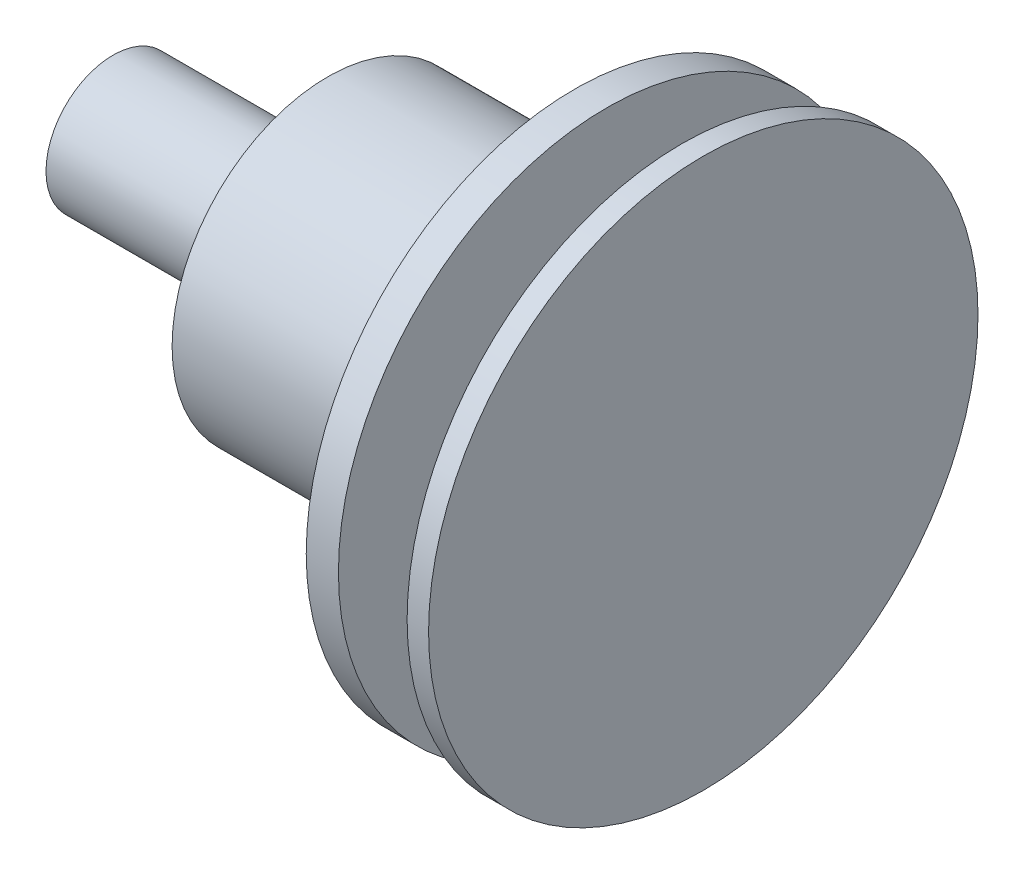
ISO-10303-21;
HEADER;
FILE_DESCRIPTION(('STEP AP214'),'2;1');
FILE_NAME('part.step','',(''),(''),'','','');
FILE_SCHEMA(('AUTOMOTIVE_DESIGN { 1 0 10303 214 1 1 1 1 }'));
ENDSEC;
DATA;
#1=APPLICATION_CONTEXT('core data for automotive mechanical design processes');
#2=APPLICATION_PROTOCOL_DEFINITION('international standard','automotive_design',2000,#1);
#3=PRODUCT_CONTEXT('',#1,'mechanical');
#4=PRODUCT('Part','Part','',(#3));
#5=PRODUCT_RELATED_PRODUCT_CATEGORY('part','',(#4));
#6=PRODUCT_DEFINITION_FORMATION('','',#4);
#7=PRODUCT_DEFINITION_CONTEXT('part definition',#1,'design');
#8=PRODUCT_DEFINITION('design','',#6,#7);
#9=PRODUCT_DEFINITION_SHAPE('','',#8);
#10=(LENGTH_UNIT() NAMED_UNIT(*) SI_UNIT(.MILLI.,.METRE.));
#11=(NAMED_UNIT(*) PLANE_ANGLE_UNIT() SI_UNIT($,.RADIAN.));
#12=(NAMED_UNIT(*) SI_UNIT($,.STERADIAN.) SOLID_ANGLE_UNIT());
#13=UNCERTAINTY_MEASURE_WITH_UNIT(LENGTH_MEASURE(1.E-05),#10,'distance_accuracy_value','');
#14=(GEOMETRIC_REPRESENTATION_CONTEXT(3) GLOBAL_UNCERTAINTY_ASSIGNED_CONTEXT((#13)) GLOBAL_UNIT_ASSIGNED_CONTEXT((#10,
#11,#12)) REPRESENTATION_CONTEXT('',''));
#15=CARTESIAN_POINT('',(0.,0.,0.));
#16=DIRECTION('',(0.,0.,1.));
#17=DIRECTION('',(1.,0.,0.));
#18=AXIS2_PLACEMENT_3D('',#15,#16,#17);
#19=CARTESIAN_POINT('',(0.,0.,0.));
#20=DIRECTION('',(1.,0.,0.));
#21=DIRECTION('',(0.,0.,-1.));
#22=AXIS2_PLACEMENT_3D('',#19,#20,#21);
#23=PLANE('',#22);
#24=CARTESIAN_POINT('',(0.,0.,0.));
#25=DIRECTION('',(-1.,0.,0.));
#26=DIRECTION('',(0.,0.,1.));
#27=AXIS2_PLACEMENT_3D('',#24,#25,#26);
#28=CIRCLE('',#27,7.93750000000001);
#29=CARTESIAN_POINT('',(0.,0.,7.93750000000001));
#30=VERTEX_POINT('',#29);
#31=EDGE_CURVE('E10',#30,#30,#28,.T.);
#32=ORIENTED_EDGE('',*,*,#31,.T.);
#33=EDGE_LOOP('',(#32));
#34=FACE_BOUND('',#33,.T.);
#35=ADVANCED_FACE('F47',(#34),#23,.F.);
#36=CARTESIAN_POINT('',(0.,0.,0.));
#37=DIRECTION('',(-1.,0.,0.));
#38=DIRECTION('',(0.,0.,1.));
#39=AXIS2_PLACEMENT_3D('',#36,#37,#38);
#40=CYLINDRICAL_SURFACE('',#39,7.93750000000001);
#41=ORIENTED_EDGE('',*,*,#31,.F.);
#42=EDGE_LOOP('',(#41));
#43=FACE_BOUND('',#42,.T.);
#44=CARTESIAN_POINT('',(25.4,0.,0.));
#45=DIRECTION('',(-1.,0.,0.));
#46=DIRECTION('',(0.,0.,1.));
#47=AXIS2_PLACEMENT_3D('',#44,#45,#46);
#48=CIRCLE('',#47,7.9375);
#49=CARTESIAN_POINT('',(25.4,0.,7.9375));
#50=VERTEX_POINT('',#49);
#51=EDGE_CURVE('E54',#50,#50,#48,.T.);
#52=ORIENTED_EDGE('',*,*,#51,.T.);
#53=EDGE_LOOP('',(#52));
#54=FACE_BOUND('',#53,.T.);
#55=ADVANCED_FACE('F107',(#43,#54),#40,.T.);
#56=CARTESIAN_POINT('',(25.4,7.9375,0.));
#57=DIRECTION('',(1.,0.,0.));
#58=DIRECTION('',(0.,0.,-1.));
#59=AXIS2_PLACEMENT_3D('',#56,#57,#58);
#60=PLANE('',#59);
#61=ORIENTED_EDGE('',*,*,#51,.F.);
#62=EDGE_LOOP('',(#61));
#63=FACE_BOUND('',#62,.T.);
#64=CARTESIAN_POINT('',(25.4,0.,0.));
#65=DIRECTION('',(-1.,0.,0.));
#66=DIRECTION('',(0.,0.,1.));
#67=AXIS2_PLACEMENT_3D('',#64,#65,#66);
#68=CIRCLE('',#67,18.415);
#69=CARTESIAN_POINT('',(25.4,0.,18.415));
#70=VERTEX_POINT('',#69);
#71=EDGE_CURVE('E59',#70,#70,#68,.T.);
#72=ORIENTED_EDGE('',*,*,#71,.T.);
#73=EDGE_LOOP('',(#72));
#74=FACE_BOUND('',#73,.T.);
#75=ADVANCED_FACE('F111',(#63,#74),#60,.F.);
#76=CARTESIAN_POINT('',(0.,0.,0.));
#77=DIRECTION('',(-1.,0.,0.));
#78=DIRECTION('',(0.,0.,1.));
#79=AXIS2_PLACEMENT_3D('',#76,#77,#78);
#80=CYLINDRICAL_SURFACE('',#79,18.415);
#81=ORIENTED_EDGE('',*,*,#71,.F.);
#82=EDGE_LOOP('',(#81));
#83=FACE_BOUND('',#82,.T.);
#84=CARTESIAN_POINT('',(54.61,0.,0.));
#85=DIRECTION('',(-1.,0.,0.));
#86=DIRECTION('',(0.,0.,1.));
#87=AXIS2_PLACEMENT_3D('',#84,#85,#86);
#88=CIRCLE('',#87,18.415);
#89=CARTESIAN_POINT('',(54.61,0.,18.415));
#90=VERTEX_POINT('',#89);
#91=EDGE_CURVE('E64',#90,#90,#88,.T.);
#92=ORIENTED_EDGE('',*,*,#91,.T.);
#93=EDGE_LOOP('',(#92));
#94=FACE_BOUND('',#93,.T.);
#95=ADVANCED_FACE('F116',(#83,#94),#80,.T.);
#96=CARTESIAN_POINT('',(54.61,18.415,0.));
#97=DIRECTION('',(1.,0.,0.));
#98=DIRECTION('',(0.,0.,-1.));
#99=AXIS2_PLACEMENT_3D('',#96,#97,#98);
#100=PLANE('',#99);
#101=ORIENTED_EDGE('',*,*,#91,.F.);
#102=EDGE_LOOP('',(#101));
#103=FACE_BOUND('',#102,.T.);
#104=CARTESIAN_POINT('',(54.61,0.,0.));
#105=DIRECTION('',(-1.,0.,0.));
#106=DIRECTION('',(0.,0.,1.));
#107=AXIS2_PLACEMENT_3D('',#104,#105,#106);
#108=CIRCLE('',#107,31.75);
#109=CARTESIAN_POINT('',(54.61,0.,31.75));
#110=VERTEX_POINT('',#109);
#111=EDGE_CURVE('E70',#110,#110,#108,.T.);
#112=ORIENTED_EDGE('',*,*,#111,.T.);
#113=EDGE_LOOP('',(#112));
#114=FACE_BOUND('',#113,.T.);
#115=ADVANCED_FACE('F122',(#103,#114),#100,.F.);
#116=CARTESIAN_POINT('',(0.,0.,0.));
#117=DIRECTION('',(-1.,0.,0.));
#118=DIRECTION('',(0.,0.,1.));
#119=AXIS2_PLACEMENT_3D('',#116,#117,#118);
#120=CYLINDRICAL_SURFACE('',#119,31.75);
#121=ORIENTED_EDGE('',*,*,#111,.F.);
#122=EDGE_LOOP('',(#121));
#123=FACE_BOUND('',#122,.T.);
#124=CARTESIAN_POINT('',(58.42,0.,0.));
#125=DIRECTION('',(-1.,0.,0.));
#126=DIRECTION('',(0.,0.,1.));
#127=AXIS2_PLACEMENT_3D('',#124,#125,#126);
#128=CIRCLE('',#127,31.75);
#129=CARTESIAN_POINT('',(58.42,0.,31.75));
#130=VERTEX_POINT('',#129);
#131=EDGE_CURVE('E74',#130,#130,#128,.T.);
#132=ORIENTED_EDGE('',*,*,#131,.T.);
#133=EDGE_LOOP('',(#132));
#134=FACE_BOUND('',#133,.T.);
#135=ADVANCED_FACE('F126',(#123,#134),#120,.T.);
#136=CARTESIAN_POINT('',(58.42,31.75,0.));
#137=DIRECTION('',(-1.,0.,0.));
#138=DIRECTION('',(0.,0.,1.));
#139=AXIS2_PLACEMENT_3D('',#136,#137,#138);
#140=PLANE('',#139);
#141=ORIENTED_EDGE('',*,*,#131,.F.);
#142=EDGE_LOOP('',(#141));
#143=FACE_BOUND('',#142,.T.);
#144=CARTESIAN_POINT('',(58.42,0.,0.));
#145=DIRECTION('',(-1.,0.,0.));
#146=DIRECTION('',(0.,0.,1.));
#147=AXIS2_PLACEMENT_3D('',#144,#145,#146);
#148=CIRCLE('',#147,19.05);
#149=CARTESIAN_POINT('',(58.42,0.,19.05));
#150=VERTEX_POINT('',#149);
#151=EDGE_CURVE('E78',#150,#150,#148,.T.);
#152=ORIENTED_EDGE('',*,*,#151,.T.);
#153=EDGE_LOOP('',(#152));
#154=FACE_BOUND('',#153,.T.);
#155=ADVANCED_FACE('F130',(#143,#154),#140,.F.);
#156=CARTESIAN_POINT('',(0.,0.,0.));
#157=DIRECTION('',(-1.,0.,0.));
#158=DIRECTION('',(0.,0.,1.));
#159=AXIS2_PLACEMENT_3D('',#156,#157,#158);
#160=CYLINDRICAL_SURFACE('',#159,19.05);
#161=ORIENTED_EDGE('',*,*,#151,.F.);
#162=EDGE_LOOP('',(#161));
#163=FACE_BOUND('',#162,.T.);
#164=CARTESIAN_POINT('',(67.31,0.,0.));
#165=DIRECTION('',(-1.,0.,0.));
#166=DIRECTION('',(0.,0.,1.));
#167=AXIS2_PLACEMENT_3D('',#164,#165,#166);
#168=CIRCLE('',#167,19.05);
#169=CARTESIAN_POINT('',(67.31,0.,19.05));
#170=VERTEX_POINT('',#169);
#171=EDGE_CURVE('E82',#170,#170,#168,.T.);
#172=ORIENTED_EDGE('',*,*,#171,.T.);
#173=EDGE_LOOP('',(#172));
#174=FACE_BOUND('',#173,.T.);
#175=ADVANCED_FACE('F134',(#163,#174),#160,.T.);
#176=CARTESIAN_POINT('',(67.31,32.512,0.));
#177=DIRECTION('',(1.,0.,0.));
#178=DIRECTION('',(0.,0.,-1.));
#179=AXIS2_PLACEMENT_3D('',#176,#177,#178);
#180=PLANE('',#179);
#181=ORIENTED_EDGE('',*,*,#171,.F.);
#182=EDGE_LOOP('',(#181));
#183=FACE_BOUND('',#182,.T.);
#184=CARTESIAN_POINT('',(67.31,0.,0.));
#185=DIRECTION('',(-1.,0.,0.));
#186=DIRECTION('',(0.,0.,1.));
#187=AXIS2_PLACEMENT_3D('',#184,#185,#186);
#188=CIRCLE('',#187,32.512);
#189=CARTESIAN_POINT('',(67.31,0.,32.512));
#190=VERTEX_POINT('',#189);
#191=EDGE_CURVE('E86',#190,#190,#188,.T.);
#192=ORIENTED_EDGE('',*,*,#191,.T.);
#193=EDGE_LOOP('',(#192));
#194=FACE_BOUND('',#193,.T.);
#195=ADVANCED_FACE('F103',(#183,#194),#180,.F.);
#196=CARTESIAN_POINT('',(0.,0.,0.));
#197=DIRECTION('',(-1.,0.,0.));
#198=DIRECTION('',(0.,0.,1.));
#199=AXIS2_PLACEMENT_3D('',#196,#197,#198);
#200=CYLINDRICAL_SURFACE('',#199,32.512);
#201=ORIENTED_EDGE('',*,*,#191,.F.);
#202=EDGE_LOOP('',(#201));
#203=FACE_BOUND('',#202,.T.);
#204=CARTESIAN_POINT('',(69.85,0.,0.));
#205=DIRECTION('',(-1.,0.,0.));
#206=DIRECTION('',(0.,0.,1.));
#207=AXIS2_PLACEMENT_3D('',#204,#205,#206);
#208=CIRCLE('',#207,32.512);
#209=CARTESIAN_POINT('',(69.85,0.,32.512));
#210=VERTEX_POINT('',#209);
#211=EDGE_CURVE('E90',#210,#210,#208,.T.);
#212=ORIENTED_EDGE('',*,*,#211,.T.);
#213=EDGE_LOOP('',(#212));
#214=FACE_BOUND('',#213,.T.);
#215=ADVANCED_FACE('F95',(#203,#214),#200,.T.);
#216=CARTESIAN_POINT('',(69.85,32.512,0.));
#217=DIRECTION('',(-1.,0.,0.));
#218=DIRECTION('',(0.,0.,1.));
#219=AXIS2_PLACEMENT_3D('',#216,#217,#218);
#220=PLANE('',#219);
#221=ORIENTED_EDGE('',*,*,#211,.F.);
#222=EDGE_LOOP('',(#221));
#223=FACE_BOUND('',#222,.T.);
#224=ADVANCED_FACE('F97',(#223),#220,.F.);
#225=CLOSED_SHELL('',(#35,#55,#75,#95,#115,#135,#155,#175,#195,#215,#224));
#226=MANIFOLD_SOLID_BREP('B2',#225);
#227=ADVANCED_BREP_SHAPE_REPRESENTATION('',(#18,#226),#14);
#228=SHAPE_DEFINITION_REPRESENTATION(#9,#227);
ENDSEC;
END-ISO-10303-21;
